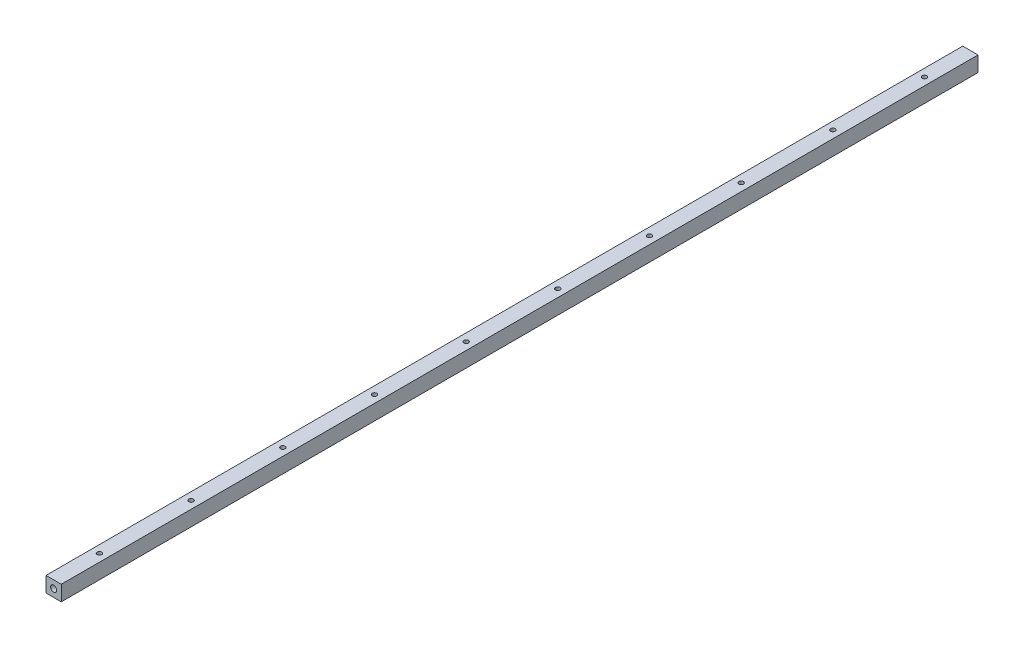
ISO-10303-21;
HEADER;
FILE_DESCRIPTION(('STEP AP214'),'2;1');
FILE_NAME('part.step','',(''),(''),'','','');
FILE_SCHEMA(('AUTOMOTIVE_DESIGN { 1 0 10303 214 1 1 1 1 }'));
ENDSEC;
DATA;
#1=APPLICATION_CONTEXT('core data for automotive mechanical design processes');
#2=APPLICATION_PROTOCOL_DEFINITION('international standard','automotive_design',2000,#1);
#3=PRODUCT_CONTEXT('',#1,'mechanical');
#4=PRODUCT('Part','Part','',(#3));
#5=PRODUCT_RELATED_PRODUCT_CATEGORY('part','',(#4));
#6=PRODUCT_DEFINITION_FORMATION('','',#4);
#7=PRODUCT_DEFINITION_CONTEXT('part definition',#1,'design');
#8=PRODUCT_DEFINITION('design','',#6,#7);
#9=PRODUCT_DEFINITION_SHAPE('','',#8);
#10=(LENGTH_UNIT() NAMED_UNIT(*) SI_UNIT(.MILLI.,.METRE.));
#11=(NAMED_UNIT(*) PLANE_ANGLE_UNIT() SI_UNIT($,.RADIAN.));
#12=(NAMED_UNIT(*) SI_UNIT($,.STERADIAN.) SOLID_ANGLE_UNIT());
#13=UNCERTAINTY_MEASURE_WITH_UNIT(LENGTH_MEASURE(1.E-05),#10,'distance_accuracy_value','');
#14=(GEOMETRIC_REPRESENTATION_CONTEXT(3) GLOBAL_UNCERTAINTY_ASSIGNED_CONTEXT((#13)) GLOBAL_UNIT_ASSIGNED_CONTEXT((#10,
#11,#12)) REPRESENTATION_CONTEXT('',''));
#15=CARTESIAN_POINT('',(0.,0.,0.));
#16=DIRECTION('',(0.,0.,1.));
#17=DIRECTION('',(1.,0.,0.));
#18=AXIS2_PLACEMENT_3D('',#15,#16,#17);
#19=CARTESIAN_POINT('',(0.,0.,600.));
#20=DIRECTION('',(1.,0.,0.));
#21=DIRECTION('',(0.,0.,-1.));
#22=AXIS2_PLACEMENT_3D('',#19,#20,#21);
#23=PLANE('',#22);
#24=DIRECTION('',(0.,-1.,0.));
#25=VECTOR('',#24,1.);
#26=CARTESIAN_POINT('',(0.,0.,0.));
#27=LINE('',#26,#25);
#28=CARTESIAN_POINT('',(0.,10.,0.));
#29=VERTEX_POINT('',#28);
#30=CARTESIAN_POINT('',(0.,0.,0.));
#31=VERTEX_POINT('',#30);
#32=EDGE_CURVE('E73',#29,#31,#27,.T.);
#33=ORIENTED_EDGE('',*,*,#32,.T.);
#34=DIRECTION('',(0.,0.,-1.));
#35=VECTOR('',#34,1.);
#36=CARTESIAN_POINT('',(0.,0.,600.));
#37=LINE('',#36,#35);
#38=CARTESIAN_POINT('',(0.,0.,600.));
#39=VERTEX_POINT('',#38);
#40=EDGE_CURVE('E80',#39,#31,#37,.T.);
#41=ORIENTED_EDGE('',*,*,#40,.F.);
#42=DIRECTION('',(0.,-1.,0.));
#43=VECTOR('',#42,1.);
#44=CARTESIAN_POINT('',(0.,0.,600.));
#45=LINE('',#44,#43);
#46=CARTESIAN_POINT('',(0.,10.,600.));
#47=VERTEX_POINT('',#46);
#48=EDGE_CURVE('E101',#47,#39,#45,.T.);
#49=ORIENTED_EDGE('',*,*,#48,.F.);
#50=DIRECTION('',(0.,0.,-1.));
#51=VECTOR('',#50,1.);
#52=CARTESIAN_POINT('',(0.,10.,600.));
#53=LINE('',#52,#51);
#54=EDGE_CURVE('E90',#47,#29,#53,.T.);
#55=ORIENTED_EDGE('',*,*,#54,.T.);
#56=EDGE_LOOP('',(#33,#41,#49,#55));
#57=FACE_BOUND('',#56,.T.);
#58=ADVANCED_FACE('F27',(#57),#23,.F.);
#59=CARTESIAN_POINT('',(0.,0.,600.));
#60=DIRECTION('',(0.,1.,0.));
#61=DIRECTION('',(0.,0.,1.));
#62=AXIS2_PLACEMENT_3D('',#59,#60,#61);
#63=PLANE('',#62);
#64=CARTESIAN_POINT('',(5.,0.,90.));
#65=DIRECTION('',(0.,1.,0.));
#66=DIRECTION('',(0.,0.,1.));
#67=AXIS2_PLACEMENT_3D('',#64,#65,#66);
#68=CIRCLE('',#67,1.5);
#69=CARTESIAN_POINT('',(5.,0.,91.5));
#70=VERTEX_POINT('',#69);
#71=EDGE_CURVE('E357',#70,#70,#68,.T.);
#72=ORIENTED_EDGE('',*,*,#71,.T.);
#73=EDGE_LOOP('',(#72));
#74=FACE_BOUND('',#73,.T.);
#75=CARTESIAN_POINT('',(5.,0.,30.));
#76=DIRECTION('',(0.,1.,0.));
#77=DIRECTION('',(0.,0.,1.));
#78=AXIS2_PLACEMENT_3D('',#75,#76,#77);
#79=CIRCLE('',#78,1.5);
#80=CARTESIAN_POINT('',(5.,0.,31.5));
#81=VERTEX_POINT('',#80);
#82=EDGE_CURVE('E322',#81,#81,#79,.T.);
#83=ORIENTED_EDGE('',*,*,#82,.T.);
#84=EDGE_LOOP('',(#83));
#85=FACE_BOUND('',#84,.T.);
#86=DIRECTION('',(1.,0.,0.));
#87=VECTOR('',#86,1.);
#88=CARTESIAN_POINT('',(0.,0.,0.));
#89=LINE('',#88,#87);
#90=CARTESIAN_POINT('',(10.,0.,0.));
#91=VERTEX_POINT('',#90);
#92=EDGE_CURVE('E68',#31,#91,#89,.T.);
#93=ORIENTED_EDGE('',*,*,#92,.T.);
#94=DIRECTION('',(0.,0.,-1.));
#95=VECTOR('',#94,1.);
#96=CARTESIAN_POINT('',(10.,0.,600.));
#97=LINE('',#96,#95);
#98=CARTESIAN_POINT('',(10.,0.,600.));
#99=VERTEX_POINT('',#98);
#100=EDGE_CURVE('E87',#99,#91,#97,.T.);
#101=ORIENTED_EDGE('',*,*,#100,.F.);
#102=DIRECTION('',(1.,0.,0.));
#103=VECTOR('',#102,1.);
#104=CARTESIAN_POINT('',(0.,0.,600.));
#105=LINE('',#104,#103);
#106=EDGE_CURVE('E83',#39,#99,#105,.T.);
#107=ORIENTED_EDGE('',*,*,#106,.F.);
#108=ORIENTED_EDGE('',*,*,#40,.T.);
#109=EDGE_LOOP('',(#93,#101,#107,#108));
#110=FACE_BOUND('',#109,.T.);
#111=CARTESIAN_POINT('',(5.,0.,150.));
#112=DIRECTION('',(0.,1.,0.));
#113=DIRECTION('',(0.,0.,1.));
#114=AXIS2_PLACEMENT_3D('',#111,#112,#113);
#115=CIRCLE('',#114,1.5);
#116=CARTESIAN_POINT('',(5.,0.,151.5));
#117=VERTEX_POINT('',#116);
#118=EDGE_CURVE('E86',#117,#117,#115,.T.);
#119=ORIENTED_EDGE('',*,*,#118,.T.);
#120=EDGE_LOOP('',(#119));
#121=FACE_BOUND('',#120,.T.);
#122=CARTESIAN_POINT('',(5.,0.,210.));
#123=DIRECTION('',(0.,1.,0.));
#124=DIRECTION('',(0.,0.,1.));
#125=AXIS2_PLACEMENT_3D('',#122,#123,#124);
#126=CIRCLE('',#125,1.5);
#127=CARTESIAN_POINT('',(5.,0.,211.5));
#128=VERTEX_POINT('',#127);
#129=EDGE_CURVE('E116',#128,#128,#126,.T.);
#130=ORIENTED_EDGE('',*,*,#129,.T.);
#131=EDGE_LOOP('',(#130));
#132=FACE_BOUND('',#131,.T.);
#133=CARTESIAN_POINT('',(5.,0.,270.));
#134=DIRECTION('',(0.,1.,0.));
#135=DIRECTION('',(0.,0.,1.));
#136=AXIS2_PLACEMENT_3D('',#133,#134,#135);
#137=CIRCLE('',#136,1.5);
#138=CARTESIAN_POINT('',(5.,0.,271.5));
#139=VERTEX_POINT('',#138);
#140=EDGE_CURVE('E122',#139,#139,#137,.T.);
#141=ORIENTED_EDGE('',*,*,#140,.T.);
#142=EDGE_LOOP('',(#141));
#143=FACE_BOUND('',#142,.T.);
#144=CARTESIAN_POINT('',(5.,0.,330.));
#145=DIRECTION('',(0.,1.,0.));
#146=DIRECTION('',(0.,0.,1.));
#147=AXIS2_PLACEMENT_3D('',#144,#145,#146);
#148=CIRCLE('',#147,1.5);
#149=CARTESIAN_POINT('',(5.,0.,331.5));
#150=VERTEX_POINT('',#149);
#151=EDGE_CURVE('E128',#150,#150,#148,.T.);
#152=ORIENTED_EDGE('',*,*,#151,.T.);
#153=EDGE_LOOP('',(#152));
#154=FACE_BOUND('',#153,.T.);
#155=CARTESIAN_POINT('',(5.,0.,390.));
#156=DIRECTION('',(0.,1.,0.));
#157=DIRECTION('',(0.,0.,1.));
#158=AXIS2_PLACEMENT_3D('',#155,#156,#157);
#159=CIRCLE('',#158,1.5);
#160=CARTESIAN_POINT('',(5.,0.,391.5));
#161=VERTEX_POINT('',#160);
#162=EDGE_CURVE('E134',#161,#161,#159,.T.);
#163=ORIENTED_EDGE('',*,*,#162,.T.);
#164=EDGE_LOOP('',(#163));
#165=FACE_BOUND('',#164,.T.);
#166=CARTESIAN_POINT('',(5.,0.,450.));
#167=DIRECTION('',(0.,1.,0.));
#168=DIRECTION('',(0.,0.,1.));
#169=AXIS2_PLACEMENT_3D('',#166,#167,#168);
#170=CIRCLE('',#169,1.5);
#171=CARTESIAN_POINT('',(5.,0.,451.5));
#172=VERTEX_POINT('',#171);
#173=EDGE_CURVE('E140',#172,#172,#170,.T.);
#174=ORIENTED_EDGE('',*,*,#173,.T.);
#175=EDGE_LOOP('',(#174));
#176=FACE_BOUND('',#175,.T.);
#177=CARTESIAN_POINT('',(5.,0.,510.));
#178=DIRECTION('',(0.,1.,0.));
#179=DIRECTION('',(0.,0.,1.));
#180=AXIS2_PLACEMENT_3D('',#177,#178,#179);
#181=CIRCLE('',#180,1.5);
#182=CARTESIAN_POINT('',(5.,0.,511.5));
#183=VERTEX_POINT('',#182);
#184=EDGE_CURVE('E146',#183,#183,#181,.T.);
#185=ORIENTED_EDGE('',*,*,#184,.T.);
#186=EDGE_LOOP('',(#185));
#187=FACE_BOUND('',#186,.T.);
#188=CARTESIAN_POINT('',(5.,0.,570.));
#189=DIRECTION('',(0.,1.,0.));
#190=DIRECTION('',(0.,0.,1.));
#191=AXIS2_PLACEMENT_3D('',#188,#189,#190);
#192=CIRCLE('',#191,1.5);
#193=CARTESIAN_POINT('',(5.,0.,571.5));
#194=VERTEX_POINT('',#193);
#195=EDGE_CURVE('E35',#194,#194,#192,.T.);
#196=ORIENTED_EDGE('',*,*,#195,.T.);
#197=EDGE_LOOP('',(#196));
#198=FACE_BOUND('',#197,.T.);
#199=ADVANCED_FACE('F81',(#74,#85,#110,#121,#132,#143,#154,#165,#176,#187,#198),#63,.F.);
#200=CARTESIAN_POINT('',(10.,0.,600.));
#201=DIRECTION('',(-1.,0.,0.));
#202=DIRECTION('',(0.,-1.,0.));
#203=AXIS2_PLACEMENT_3D('',#200,#201,#202);
#204=PLANE('',#203);
#205=DIRECTION('',(0.,1.,0.));
#206=VECTOR('',#205,1.);
#207=CARTESIAN_POINT('',(10.,0.,0.));
#208=LINE('',#207,#206);
#209=CARTESIAN_POINT('',(10.,10.,0.));
#210=VERTEX_POINT('',#209);
#211=EDGE_CURVE('E74',#91,#210,#208,.T.);
#212=ORIENTED_EDGE('',*,*,#211,.T.);
#213=DIRECTION('',(0.,0.,-1.));
#214=VECTOR('',#213,1.);
#215=CARTESIAN_POINT('',(10.,10.,600.));
#216=LINE('',#215,#214);
#217=CARTESIAN_POINT('',(10.,10.,600.));
#218=VERTEX_POINT('',#217);
#219=EDGE_CURVE('E107',#218,#210,#216,.T.);
#220=ORIENTED_EDGE('',*,*,#219,.F.);
#221=DIRECTION('',(0.,1.,0.));
#222=VECTOR('',#221,1.);
#223=CARTESIAN_POINT('',(10.,0.,600.));
#224=LINE('',#223,#222);
#225=EDGE_CURVE('E47',#99,#218,#224,.T.);
#226=ORIENTED_EDGE('',*,*,#225,.F.);
#227=ORIENTED_EDGE('',*,*,#100,.T.);
#228=EDGE_LOOP('',(#212,#220,#226,#227));
#229=FACE_BOUND('',#228,.T.);
#230=ADVANCED_FACE('F163',(#229),#204,.F.);
#231=CARTESIAN_POINT('',(0.,10.,600.));
#232=DIRECTION('',(0.,-1.,0.));
#233=DIRECTION('',(0.,0.,-1.));
#234=AXIS2_PLACEMENT_3D('',#231,#232,#233);
#235=PLANE('',#234);
#236=CARTESIAN_POINT('',(5.,10.,90.));
#237=DIRECTION('',(0.,1.,0.));
#238=DIRECTION('',(0.,0.,1.));
#239=AXIS2_PLACEMENT_3D('',#236,#237,#238);
#240=CIRCLE('',#239,1.5);
#241=CARTESIAN_POINT('',(5.,10.,91.5));
#242=VERTEX_POINT('',#241);
#243=EDGE_CURVE('E354',#242,#242,#240,.T.);
#244=ORIENTED_EDGE('',*,*,#243,.F.);
#245=EDGE_LOOP('',(#244));
#246=FACE_BOUND('',#245,.T.);
#247=CARTESIAN_POINT('',(5.,10.,30.));
#248=DIRECTION('',(0.,1.,0.));
#249=DIRECTION('',(0.,0.,1.));
#250=AXIS2_PLACEMENT_3D('',#247,#248,#249);
#251=CIRCLE('',#250,1.5);
#252=CARTESIAN_POINT('',(5.,10.,31.5));
#253=VERTEX_POINT('',#252);
#254=EDGE_CURVE('E327',#253,#253,#251,.T.);
#255=ORIENTED_EDGE('',*,*,#254,.F.);
#256=EDGE_LOOP('',(#255));
#257=FACE_BOUND('',#256,.T.);
#258=DIRECTION('',(-1.,0.,0.));
#259=VECTOR('',#258,1.);
#260=CARTESIAN_POINT('',(0.,10.,0.));
#261=LINE('',#260,#259);
#262=EDGE_CURVE('E99',#210,#29,#261,.T.);
#263=ORIENTED_EDGE('',*,*,#262,.T.);
#264=ORIENTED_EDGE('',*,*,#54,.F.);
#265=DIRECTION('',(-1.,0.,0.));
#266=VECTOR('',#265,1.);
#267=CARTESIAN_POINT('',(0.,10.,600.));
#268=LINE('',#267,#266);
#269=EDGE_CURVE('E42',#218,#47,#268,.T.);
#270=ORIENTED_EDGE('',*,*,#269,.F.);
#271=ORIENTED_EDGE('',*,*,#219,.T.);
#272=EDGE_LOOP('',(#263,#264,#270,#271));
#273=FACE_BOUND('',#272,.T.);
#274=CARTESIAN_POINT('',(5.,10.,150.));
#275=DIRECTION('',(0.,1.,0.));
#276=DIRECTION('',(0.,0.,1.));
#277=AXIS2_PLACEMENT_3D('',#274,#275,#276);
#278=CIRCLE('',#277,1.5);
#279=CARTESIAN_POINT('',(5.,10.,151.5));
#280=VERTEX_POINT('',#279);
#281=EDGE_CURVE('E113',#280,#280,#278,.T.);
#282=ORIENTED_EDGE('',*,*,#281,.F.);
#283=EDGE_LOOP('',(#282));
#284=FACE_BOUND('',#283,.T.);
#285=CARTESIAN_POINT('',(5.,10.,210.));
#286=DIRECTION('',(0.,1.,0.));
#287=DIRECTION('',(0.,0.,1.));
#288=AXIS2_PLACEMENT_3D('',#285,#286,#287);
#289=CIRCLE('',#288,1.5);
#290=CARTESIAN_POINT('',(5.,10.,211.5));
#291=VERTEX_POINT('',#290);
#292=EDGE_CURVE('E119',#291,#291,#289,.T.);
#293=ORIENTED_EDGE('',*,*,#292,.F.);
#294=EDGE_LOOP('',(#293));
#295=FACE_BOUND('',#294,.T.);
#296=CARTESIAN_POINT('',(5.,10.,270.));
#297=DIRECTION('',(0.,1.,0.));
#298=DIRECTION('',(0.,0.,1.));
#299=AXIS2_PLACEMENT_3D('',#296,#297,#298);
#300=CIRCLE('',#299,1.5);
#301=CARTESIAN_POINT('',(5.,10.,271.5));
#302=VERTEX_POINT('',#301);
#303=EDGE_CURVE('E125',#302,#302,#300,.T.);
#304=ORIENTED_EDGE('',*,*,#303,.F.);
#305=EDGE_LOOP('',(#304));
#306=FACE_BOUND('',#305,.T.);
#307=CARTESIAN_POINT('',(5.,10.,330.));
#308=DIRECTION('',(0.,1.,0.));
#309=DIRECTION('',(0.,0.,1.));
#310=AXIS2_PLACEMENT_3D('',#307,#308,#309);
#311=CIRCLE('',#310,1.5);
#312=CARTESIAN_POINT('',(5.,10.,331.5));
#313=VERTEX_POINT('',#312);
#314=EDGE_CURVE('E131',#313,#313,#311,.T.);
#315=ORIENTED_EDGE('',*,*,#314,.F.);
#316=EDGE_LOOP('',(#315));
#317=FACE_BOUND('',#316,.T.);
#318=CARTESIAN_POINT('',(5.,10.,390.));
#319=DIRECTION('',(0.,1.,0.));
#320=DIRECTION('',(0.,0.,1.));
#321=AXIS2_PLACEMENT_3D('',#318,#319,#320);
#322=CIRCLE('',#321,1.5);
#323=CARTESIAN_POINT('',(5.,10.,391.5));
#324=VERTEX_POINT('',#323);
#325=EDGE_CURVE('E137',#324,#324,#322,.T.);
#326=ORIENTED_EDGE('',*,*,#325,.F.);
#327=EDGE_LOOP('',(#326));
#328=FACE_BOUND('',#327,.T.);
#329=CARTESIAN_POINT('',(5.,10.,450.));
#330=DIRECTION('',(0.,1.,0.));
#331=DIRECTION('',(0.,0.,1.));
#332=AXIS2_PLACEMENT_3D('',#329,#330,#331);
#333=CIRCLE('',#332,1.5);
#334=CARTESIAN_POINT('',(5.,10.,451.5));
#335=VERTEX_POINT('',#334);
#336=EDGE_CURVE('E143',#335,#335,#333,.T.);
#337=ORIENTED_EDGE('',*,*,#336,.F.);
#338=EDGE_LOOP('',(#337));
#339=FACE_BOUND('',#338,.T.);
#340=CARTESIAN_POINT('',(5.,10.,510.));
#341=DIRECTION('',(0.,1.,0.));
#342=DIRECTION('',(0.,0.,1.));
#343=AXIS2_PLACEMENT_3D('',#340,#341,#342);
#344=CIRCLE('',#343,1.5);
#345=CARTESIAN_POINT('',(5.,10.,511.5));
#346=VERTEX_POINT('',#345);
#347=EDGE_CURVE('E149',#346,#346,#344,.T.);
#348=ORIENTED_EDGE('',*,*,#347,.F.);
#349=EDGE_LOOP('',(#348));
#350=FACE_BOUND('',#349,.T.);
#351=CARTESIAN_POINT('',(5.,10.,570.));
#352=DIRECTION('',(0.,1.,0.));
#353=DIRECTION('',(0.,0.,1.));
#354=AXIS2_PLACEMENT_3D('',#351,#352,#353);
#355=CIRCLE('',#354,1.5);
#356=CARTESIAN_POINT('',(5.,10.,571.5));
#357=VERTEX_POINT('',#356);
#358=EDGE_CURVE('E11',#357,#357,#355,.T.);
#359=ORIENTED_EDGE('',*,*,#358,.F.);
#360=EDGE_LOOP('',(#359));
#361=FACE_BOUND('',#360,.T.);
#362=ADVANCED_FACE('F160',(#246,#257,#273,#284,#295,#306,#317,#328,#339,#350,#361),#235,.F.);
#363=CARTESIAN_POINT('',(0.,10.,600.));
#364=DIRECTION('',(0.,0.,-1.));
#365=DIRECTION('',(-1.,0.,0.));
#366=AXIS2_PLACEMENT_3D('',#363,#364,#365);
#367=PLANE('',#366);
#368=CARTESIAN_POINT('',(5.,5.,600.));
#369=DIRECTION('',(0.,0.,1.));
#370=DIRECTION('',(1.,0.,0.));
#371=AXIS2_PLACEMENT_3D('',#368,#369,#370);
#372=CIRCLE('',#371,2.);
#373=CARTESIAN_POINT('',(7.,5.,600.));
#374=VERTEX_POINT('',#373);
#375=EDGE_CURVE('E94',#374,#374,#372,.T.);
#376=ORIENTED_EDGE('',*,*,#375,.F.);
#377=EDGE_LOOP('',(#376));
#378=FACE_BOUND('',#377,.T.);
#379=ORIENTED_EDGE('',*,*,#48,.T.);
#380=ORIENTED_EDGE('',*,*,#106,.T.);
#381=ORIENTED_EDGE('',*,*,#225,.T.);
#382=ORIENTED_EDGE('',*,*,#269,.T.);
#383=EDGE_LOOP('',(#379,#380,#381,#382));
#384=FACE_BOUND('',#383,.T.);
#385=ADVANCED_FACE('F162',(#378,#384),#367,.F.);
#386=CARTESIAN_POINT('',(0.,10.,0.));
#387=DIRECTION('',(0.,0.,-1.));
#388=DIRECTION('',(-1.,0.,0.));
#389=AXIS2_PLACEMENT_3D('',#386,#387,#388);
#390=PLANE('',#389);
#391=CARTESIAN_POINT('',(5.,5.,0.));
#392=DIRECTION('',(0.,0.,-1.));
#393=DIRECTION('',(-1.,0.,0.));
#394=AXIS2_PLACEMENT_3D('',#391,#392,#393);
#395=CIRCLE('',#394,2.);
#396=CARTESIAN_POINT('',(3.,5.,0.));
#397=VERTEX_POINT('',#396);
#398=EDGE_CURVE('E319',#397,#397,#395,.T.);
#399=ORIENTED_EDGE('',*,*,#398,.F.);
#400=EDGE_LOOP('',(#399));
#401=FACE_BOUND('',#400,.T.);
#402=ORIENTED_EDGE('',*,*,#32,.F.);
#403=ORIENTED_EDGE('',*,*,#262,.F.);
#404=ORIENTED_EDGE('',*,*,#211,.F.);
#405=ORIENTED_EDGE('',*,*,#92,.F.);
#406=EDGE_LOOP('',(#402,#403,#404,#405));
#407=FACE_BOUND('',#406,.T.);
#408=ADVANCED_FACE('F70',(#401,#407),#390,.T.);
#409=CARTESIAN_POINT('',(5.,5.,580.));
#410=DIRECTION('',(0.,0.,1.));
#411=DIRECTION('',(1.,0.,0.));
#412=AXIS2_PLACEMENT_3D('',#409,#410,#411);
#413=CYLINDRICAL_SURFACE('',#412,2.);
#414=CARTESIAN_POINT('',(5.,5.,580.));
#415=DIRECTION('',(0.,0.,1.));
#416=DIRECTION('',(1.,0.,0.));
#417=AXIS2_PLACEMENT_3D('',#414,#415,#416);
#418=CIRCLE('',#417,2.);
#419=CARTESIAN_POINT('',(7.,5.,580.));
#420=VERTEX_POINT('',#419);
#421=EDGE_CURVE('E91',#420,#420,#418,.T.);
#422=ORIENTED_EDGE('',*,*,#421,.F.);
#423=EDGE_LOOP('',(#422));
#424=FACE_BOUND('',#423,.T.);
#425=ORIENTED_EDGE('',*,*,#375,.T.);
#426=EDGE_LOOP('',(#425));
#427=FACE_BOUND('',#426,.T.);
#428=ADVANCED_FACE('F285',(#424,#427),#413,.F.);
#429=CARTESIAN_POINT('',(5.,5.,580.));
#430=DIRECTION('',(0.,0.,1.));
#431=DIRECTION('',(1.,0.,0.));
#432=AXIS2_PLACEMENT_3D('',#429,#430,#431);
#433=PLANE('',#432);
#434=ORIENTED_EDGE('',*,*,#421,.T.);
#435=EDGE_LOOP('',(#434));
#436=FACE_BOUND('',#435,.T.);
#437=ADVANCED_FACE('F276',(#436),#433,.T.);
#438=CARTESIAN_POINT('',(5.,5.,20.));
#439=DIRECTION('',(0.,0.,-1.));
#440=DIRECTION('',(-1.,0.,0.));
#441=AXIS2_PLACEMENT_3D('',#438,#439,#440);
#442=CYLINDRICAL_SURFACE('',#441,2.);
#443=CARTESIAN_POINT('',(5.,5.,20.));
#444=DIRECTION('',(0.,0.,-1.));
#445=DIRECTION('',(-1.,0.,0.));
#446=AXIS2_PLACEMENT_3D('',#443,#444,#445);
#447=CIRCLE('',#446,2.);
#448=CARTESIAN_POINT('',(3.,5.,20.));
#449=VERTEX_POINT('',#448);
#450=EDGE_CURVE('E321',#449,#449,#447,.T.);
#451=ORIENTED_EDGE('',*,*,#450,.F.);
#452=EDGE_LOOP('',(#451));
#453=FACE_BOUND('',#452,.T.);
#454=ORIENTED_EDGE('',*,*,#398,.T.);
#455=EDGE_LOOP('',(#454));
#456=FACE_BOUND('',#455,.T.);
#457=ADVANCED_FACE('F268',(#453,#456),#442,.F.);
#458=CARTESIAN_POINT('',(5.,5.,20.));
#459=DIRECTION('',(0.,0.,-1.));
#460=DIRECTION('',(-1.,0.,0.));
#461=AXIS2_PLACEMENT_3D('',#458,#459,#460);
#462=PLANE('',#461);
#463=ORIENTED_EDGE('',*,*,#450,.T.);
#464=EDGE_LOOP('',(#463));
#465=FACE_BOUND('',#464,.T.);
#466=ADVANCED_FACE('F260',(#465),#462,.T.);
#467=CARTESIAN_POINT('',(5.,0.,30.));
#468=DIRECTION('',(0.,1.,0.));
#469=DIRECTION('',(0.,0.,1.));
#470=AXIS2_PLACEMENT_3D('',#467,#468,#469);
#471=CYLINDRICAL_SURFACE('',#470,1.5);
#472=ORIENTED_EDGE('',*,*,#82,.F.);
#473=EDGE_LOOP('',(#472));
#474=FACE_BOUND('',#473,.T.);
#475=ORIENTED_EDGE('',*,*,#254,.T.);
#476=EDGE_LOOP('',(#475));
#477=FACE_BOUND('',#476,.T.);
#478=ADVANCED_FACE('F250',(#474,#477),#471,.F.);
#479=CARTESIAN_POINT('',(5.,0.,90.));
#480=DIRECTION('',(0.,1.,0.));
#481=DIRECTION('',(0.,0.,1.));
#482=AXIS2_PLACEMENT_3D('',#479,#480,#481);
#483=CYLINDRICAL_SURFACE('',#482,1.5);
#484=ORIENTED_EDGE('',*,*,#71,.F.);
#485=EDGE_LOOP('',(#484));
#486=FACE_BOUND('',#485,.T.);
#487=ORIENTED_EDGE('',*,*,#243,.T.);
#488=EDGE_LOOP('',(#487));
#489=FACE_BOUND('',#488,.T.);
#490=ADVANCED_FACE('F189',(#486,#489),#483,.F.);
#491=CARTESIAN_POINT('',(5.,0.,150.));
#492=DIRECTION('',(0.,1.,0.));
#493=DIRECTION('',(0.,0.,1.));
#494=AXIS2_PLACEMENT_3D('',#491,#492,#493);
#495=CYLINDRICAL_SURFACE('',#494,1.5);
#496=ORIENTED_EDGE('',*,*,#118,.F.);
#497=EDGE_LOOP('',(#496));
#498=FACE_BOUND('',#497,.T.);
#499=ORIENTED_EDGE('',*,*,#281,.T.);
#500=EDGE_LOOP('',(#499));
#501=FACE_BOUND('',#500,.T.);
#502=ADVANCED_FACE('F185',(#498,#501),#495,.F.);
#503=CARTESIAN_POINT('',(5.,0.,210.));
#504=DIRECTION('',(0.,1.,0.));
#505=DIRECTION('',(0.,0.,1.));
#506=AXIS2_PLACEMENT_3D('',#503,#504,#505);
#507=CYLINDRICAL_SURFACE('',#506,1.5);
#508=ORIENTED_EDGE('',*,*,#129,.F.);
#509=EDGE_LOOP('',(#508));
#510=FACE_BOUND('',#509,.T.);
#511=ORIENTED_EDGE('',*,*,#292,.T.);
#512=EDGE_LOOP('',(#511));
#513=FACE_BOUND('',#512,.T.);
#514=ADVANCED_FACE('F188',(#510,#513),#507,.F.);
#515=CARTESIAN_POINT('',(5.,0.,270.));
#516=DIRECTION('',(0.,1.,0.));
#517=DIRECTION('',(0.,0.,1.));
#518=AXIS2_PLACEMENT_3D('',#515,#516,#517);
#519=CYLINDRICAL_SURFACE('',#518,1.5);
#520=ORIENTED_EDGE('',*,*,#140,.F.);
#521=EDGE_LOOP('',(#520));
#522=FACE_BOUND('',#521,.T.);
#523=ORIENTED_EDGE('',*,*,#303,.T.);
#524=EDGE_LOOP('',(#523));
#525=FACE_BOUND('',#524,.T.);
#526=ADVANCED_FACE('F193',(#522,#525),#519,.F.);
#527=CARTESIAN_POINT('',(5.,0.,330.));
#528=DIRECTION('',(0.,1.,0.));
#529=DIRECTION('',(0.,0.,1.));
#530=AXIS2_PLACEMENT_3D('',#527,#528,#529);
#531=CYLINDRICAL_SURFACE('',#530,1.5);
#532=ORIENTED_EDGE('',*,*,#151,.F.);
#533=EDGE_LOOP('',(#532));
#534=FACE_BOUND('',#533,.T.);
#535=ORIENTED_EDGE('',*,*,#314,.T.);
#536=EDGE_LOOP('',(#535));
#537=FACE_BOUND('',#536,.T.);
#538=ADVANCED_FACE('F197',(#534,#537),#531,.F.);
#539=CARTESIAN_POINT('',(5.,0.,390.));
#540=DIRECTION('',(0.,1.,0.));
#541=DIRECTION('',(0.,0.,1.));
#542=AXIS2_PLACEMENT_3D('',#539,#540,#541);
#543=CYLINDRICAL_SURFACE('',#542,1.5);
#544=ORIENTED_EDGE('',*,*,#162,.F.);
#545=EDGE_LOOP('',(#544));
#546=FACE_BOUND('',#545,.T.);
#547=ORIENTED_EDGE('',*,*,#325,.T.);
#548=EDGE_LOOP('',(#547));
#549=FACE_BOUND('',#548,.T.);
#550=ADVANCED_FACE('F201',(#546,#549),#543,.F.);
#551=CARTESIAN_POINT('',(5.,0.,450.));
#552=DIRECTION('',(0.,1.,0.));
#553=DIRECTION('',(0.,0.,1.));
#554=AXIS2_PLACEMENT_3D('',#551,#552,#553);
#555=CYLINDRICAL_SURFACE('',#554,1.5);
#556=ORIENTED_EDGE('',*,*,#173,.F.);
#557=EDGE_LOOP('',(#556));
#558=FACE_BOUND('',#557,.T.);
#559=ORIENTED_EDGE('',*,*,#336,.T.);
#560=EDGE_LOOP('',(#559));
#561=FACE_BOUND('',#560,.T.);
#562=ADVANCED_FACE('F205',(#558,#561),#555,.F.);
#563=CARTESIAN_POINT('',(5.,0.,510.));
#564=DIRECTION('',(0.,1.,0.));
#565=DIRECTION('',(0.,0.,1.));
#566=AXIS2_PLACEMENT_3D('',#563,#564,#565);
#567=CYLINDRICAL_SURFACE('',#566,1.5);
#568=ORIENTED_EDGE('',*,*,#184,.F.);
#569=EDGE_LOOP('',(#568));
#570=FACE_BOUND('',#569,.T.);
#571=ORIENTED_EDGE('',*,*,#347,.T.);
#572=EDGE_LOOP('',(#571));
#573=FACE_BOUND('',#572,.T.);
#574=ADVANCED_FACE('F157',(#570,#573),#567,.F.);
#575=CARTESIAN_POINT('',(5.,0.,570.));
#576=DIRECTION('',(0.,1.,0.));
#577=DIRECTION('',(0.,0.,1.));
#578=AXIS2_PLACEMENT_3D('',#575,#576,#577);
#579=CYLINDRICAL_SURFACE('',#578,1.5);
#580=ORIENTED_EDGE('',*,*,#195,.F.);
#581=EDGE_LOOP('',(#580));
#582=FACE_BOUND('',#581,.T.);
#583=ORIENTED_EDGE('',*,*,#358,.T.);
#584=EDGE_LOOP('',(#583));
#585=FACE_BOUND('',#584,.T.);
#586=ADVANCED_FACE('F29',(#582,#585),#579,.F.);
#587=CLOSED_SHELL('',(#58,#199,#230,#362,#385,#408,#428,#437,#457,#466,#478,#490,#502,#514,#526,
#538,#550,#562,#574,#586));
#588=MANIFOLD_SOLID_BREP('B2',#587);
#589=ADVANCED_BREP_SHAPE_REPRESENTATION('',(#18,#588),#14);
#590=SHAPE_DEFINITION_REPRESENTATION(#9,#589);
ENDSEC;
END-ISO-10303-21;
